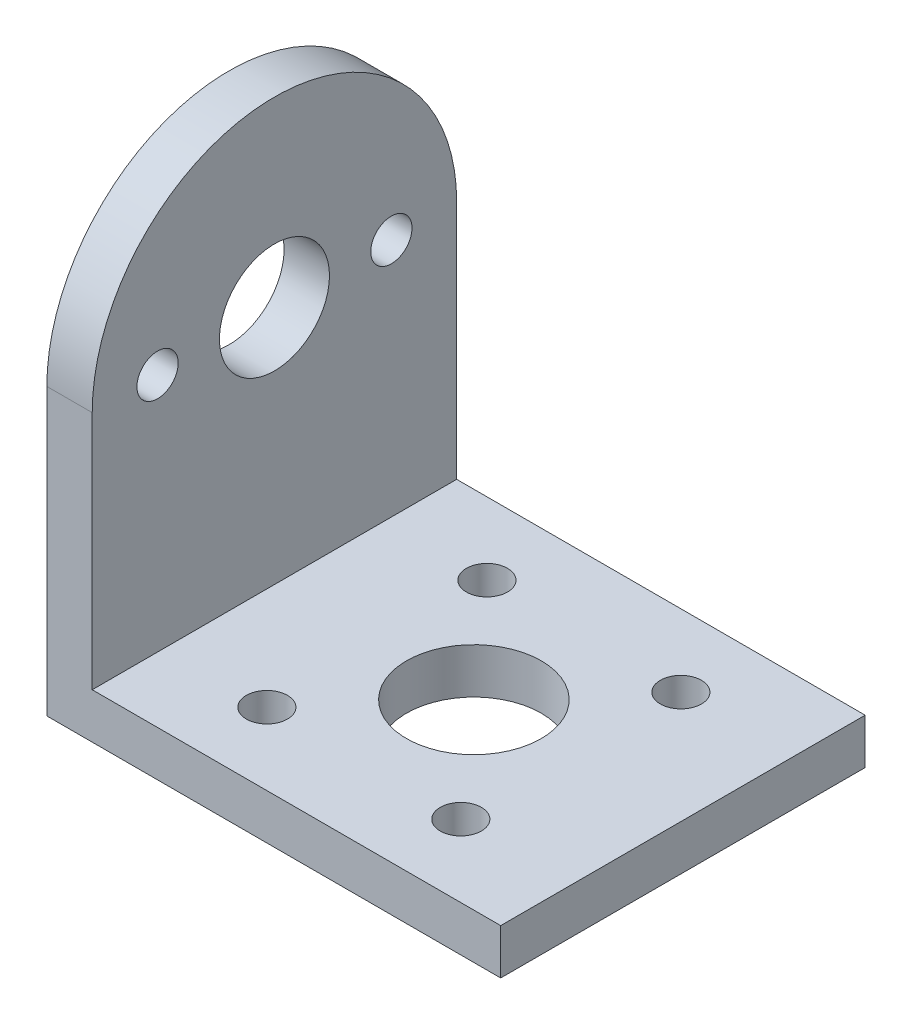
ISO-10303-21;
HEADER;
FILE_DESCRIPTION(('STEP AP214'),'2;1');
FILE_NAME('part.step','',(''),(''),'','','');
FILE_SCHEMA(('AUTOMOTIVE_DESIGN { 1 0 10303 214 1 1 1 1 }'));
ENDSEC;
DATA;
#1=APPLICATION_CONTEXT('core data for automotive mechanical design processes');
#2=APPLICATION_PROTOCOL_DEFINITION('international standard','automotive_design',2000,#1);
#3=PRODUCT_CONTEXT('',#1,'mechanical');
#4=PRODUCT('Part','Part','',(#3));
#5=PRODUCT_RELATED_PRODUCT_CATEGORY('part','',(#4));
#6=PRODUCT_DEFINITION_FORMATION('','',#4);
#7=PRODUCT_DEFINITION_CONTEXT('part definition',#1,'design');
#8=PRODUCT_DEFINITION('design','',#6,#7);
#9=PRODUCT_DEFINITION_SHAPE('','',#8);
#10=(LENGTH_UNIT() NAMED_UNIT(*) SI_UNIT(.MILLI.,.METRE.));
#11=(NAMED_UNIT(*) PLANE_ANGLE_UNIT() SI_UNIT($,.RADIAN.));
#12=(NAMED_UNIT(*) SI_UNIT($,.STERADIAN.) SOLID_ANGLE_UNIT());
#13=UNCERTAINTY_MEASURE_WITH_UNIT(LENGTH_MEASURE(1.E-05),#10,'distance_accuracy_value','');
#14=(GEOMETRIC_REPRESENTATION_CONTEXT(3) GLOBAL_UNCERTAINTY_ASSIGNED_CONTEXT((#13)) GLOBAL_UNIT_ASSIGNED_CONTEXT((#10,
#11,#12)) REPRESENTATION_CONTEXT('',''));
#15=CARTESIAN_POINT('',(0.,0.,0.));
#16=DIRECTION('',(0.,0.,1.));
#17=DIRECTION('',(1.,0.,0.));
#18=AXIS2_PLACEMENT_3D('',#15,#16,#17);
#19=CARTESIAN_POINT('',(3.3,0.,0.));
#20=DIRECTION('',(1.,0.,0.));
#21=DIRECTION('',(0.,0.,-1.));
#22=AXIS2_PLACEMENT_3D('',#19,#20,#21);
#23=PLANE('',#22);
#24=CARTESIAN_POINT('',(3.3,0.,0.));
#25=DIRECTION('',(1.,0.,0.));
#26=DIRECTION('',(0.,0.,-1.));
#27=AXIS2_PLACEMENT_3D('',#24,#25,#26);
#28=CIRCLE('',#27,4.);
#29=CARTESIAN_POINT('',(3.3,0.,-4.));
#30=VERTEX_POINT('',#29);
#31=EDGE_CURVE('E127',#30,#30,#28,.T.);
#32=ORIENTED_EDGE('',*,*,#31,.F.);
#33=EDGE_LOOP('',(#32));
#34=FACE_BOUND('',#33,.T.);
#35=CARTESIAN_POINT('',(3.3,0.,-8.5));
#36=DIRECTION('',(1.,0.,0.));
#37=DIRECTION('',(0.,0.,-1.));
#38=AXIS2_PLACEMENT_3D('',#35,#36,#37);
#39=CIRCLE('',#38,1.5);
#40=CARTESIAN_POINT('',(3.3,0.,-10.));
#41=VERTEX_POINT('',#40);
#42=EDGE_CURVE('E133',#41,#41,#39,.T.);
#43=ORIENTED_EDGE('',*,*,#42,.F.);
#44=EDGE_LOOP('',(#43));
#45=FACE_BOUND('',#44,.T.);
#46=CARTESIAN_POINT('',(3.3,0.,8.5));
#47=DIRECTION('',(1.,0.,0.));
#48=DIRECTION('',(0.,0.,1.));
#49=AXIS2_PLACEMENT_3D('',#46,#47,#48);
#50=CIRCLE('',#49,1.5);
#51=CARTESIAN_POINT('',(3.3,0.,10.));
#52=VERTEX_POINT('',#51);
#53=EDGE_CURVE('E121',#52,#52,#50,.T.);
#54=ORIENTED_EDGE('',*,*,#53,.F.);
#55=EDGE_LOOP('',(#54));
#56=FACE_BOUND('',#55,.T.);
#57=DIRECTION('',(0.,-1.,0.));
#58=VECTOR('',#57,1.);
#59=CARTESIAN_POINT('',(3.3,0.,13.25));
#60=LINE('',#59,#58);
#61=CARTESIAN_POINT('',(3.3,0.,13.25));
#62=VERTEX_POINT('',#61);
#63=CARTESIAN_POINT('',(3.3,-17.45,13.25));
#64=VERTEX_POINT('',#63);
#65=EDGE_CURVE('E51',#62,#64,#60,.T.);
#66=ORIENTED_EDGE('',*,*,#65,.T.);
#67=DIRECTION('',(0.,0.,-1.));
#68=VECTOR('',#67,1.);
#69=CARTESIAN_POINT('',(3.3,-17.45,0.));
#70=LINE('',#69,#68);
#71=CARTESIAN_POINT('',(3.3,-17.45,-13.25));
#72=VERTEX_POINT('',#71);
#73=EDGE_CURVE('E55',#64,#72,#70,.T.);
#74=ORIENTED_EDGE('',*,*,#73,.T.);
#75=DIRECTION('',(0.,1.,0.));
#76=VECTOR('',#75,1.);
#77=CARTESIAN_POINT('',(3.3,-20.75,-13.25));
#78=LINE('',#77,#76);
#79=CARTESIAN_POINT('',(3.3,0.,-13.25));
#80=VERTEX_POINT('',#79);
#81=EDGE_CURVE('E94',#72,#80,#78,.T.);
#82=ORIENTED_EDGE('',*,*,#81,.T.);
#83=CARTESIAN_POINT('',(3.3,0.,0.));
#84=DIRECTION('',(1.,0.,0.));
#85=DIRECTION('',(0.,0.,-1.));
#86=AXIS2_PLACEMENT_3D('',#83,#84,#85);
#87=CIRCLE('',#86,13.25);
#88=EDGE_CURVE('E139',#80,#62,#87,.T.);
#89=ORIENTED_EDGE('',*,*,#88,.T.);
#90=EDGE_LOOP('',(#66,#74,#82,#89));
#91=FACE_BOUND('',#90,.T.);
#92=ADVANCED_FACE('F36',(#34,#45,#56,#91),#23,.T.);
#93=CARTESIAN_POINT('',(0.,0.,0.));
#94=DIRECTION('',(1.,0.,0.));
#95=DIRECTION('',(0.,0.,-1.));
#96=AXIS2_PLACEMENT_3D('',#93,#94,#95);
#97=PLANE('',#96);
#98=DIRECTION('',(0.,0.,-1.));
#99=VECTOR('',#98,1.);
#100=CARTESIAN_POINT('',(0.,-20.75,13.25));
#101=LINE('',#100,#99);
#102=CARTESIAN_POINT('',(0.,-20.75,13.25));
#103=VERTEX_POINT('',#102);
#104=CARTESIAN_POINT('',(0.,-20.75,-13.25));
#105=VERTEX_POINT('',#104);
#106=EDGE_CURVE('E149',#103,#105,#101,.T.);
#107=ORIENTED_EDGE('',*,*,#106,.F.);
#108=DIRECTION('',(0.,-1.,0.));
#109=VECTOR('',#108,1.);
#110=CARTESIAN_POINT('',(0.,0.,13.25));
#111=LINE('',#110,#109);
#112=CARTESIAN_POINT('',(0.,0.,13.25));
#113=VERTEX_POINT('',#112);
#114=EDGE_CURVE('E147',#113,#103,#111,.T.);
#115=ORIENTED_EDGE('',*,*,#114,.F.);
#116=CARTESIAN_POINT('',(0.,0.,0.));
#117=DIRECTION('',(1.,0.,0.));
#118=DIRECTION('',(0.,0.,-1.));
#119=AXIS2_PLACEMENT_3D('',#116,#117,#118);
#120=CIRCLE('',#119,13.25);
#121=CARTESIAN_POINT('',(0.,0.,-13.25));
#122=VERTEX_POINT('',#121);
#123=EDGE_CURVE('E136',#122,#113,#120,.T.);
#124=ORIENTED_EDGE('',*,*,#123,.F.);
#125=DIRECTION('',(0.,1.,0.));
#126=VECTOR('',#125,1.);
#127=CARTESIAN_POINT('',(0.,-20.75,-13.25));
#128=LINE('',#127,#126);
#129=EDGE_CURVE('E141',#105,#122,#128,.T.);
#130=ORIENTED_EDGE('',*,*,#129,.F.);
#131=EDGE_LOOP('',(#107,#115,#124,#130));
#132=FACE_BOUND('',#131,.T.);
#133=CARTESIAN_POINT('',(0.,0.,8.5));
#134=DIRECTION('',(1.,0.,0.));
#135=DIRECTION('',(0.,0.,1.));
#136=AXIS2_PLACEMENT_3D('',#133,#134,#135);
#137=CIRCLE('',#136,1.5);
#138=CARTESIAN_POINT('',(0.,0.,10.));
#139=VERTEX_POINT('',#138);
#140=EDGE_CURVE('E120',#139,#139,#137,.T.);
#141=ORIENTED_EDGE('',*,*,#140,.T.);
#142=EDGE_LOOP('',(#141));
#143=FACE_BOUND('',#142,.T.);
#144=CARTESIAN_POINT('',(0.,0.,0.));
#145=DIRECTION('',(1.,0.,0.));
#146=DIRECTION('',(0.,0.,-1.));
#147=AXIS2_PLACEMENT_3D('',#144,#145,#146);
#148=CIRCLE('',#147,4.);
#149=CARTESIAN_POINT('',(0.,0.,-4.));
#150=VERTEX_POINT('',#149);
#151=EDGE_CURVE('E124',#150,#150,#148,.T.);
#152=ORIENTED_EDGE('',*,*,#151,.T.);
#153=EDGE_LOOP('',(#152));
#154=FACE_BOUND('',#153,.T.);
#155=CARTESIAN_POINT('',(0.,0.,-8.5));
#156=DIRECTION('',(1.,0.,0.));
#157=DIRECTION('',(0.,0.,-1.));
#158=AXIS2_PLACEMENT_3D('',#155,#156,#157);
#159=CIRCLE('',#158,1.5);
#160=CARTESIAN_POINT('',(0.,0.,-10.));
#161=VERTEX_POINT('',#160);
#162=EDGE_CURVE('E130',#161,#161,#159,.T.);
#163=ORIENTED_EDGE('',*,*,#162,.T.);
#164=EDGE_LOOP('',(#163));
#165=FACE_BOUND('',#164,.T.);
#166=ADVANCED_FACE('F163',(#132,#143,#154,#165),#97,.F.);
#167=CARTESIAN_POINT('',(3.3,0.,0.));
#168=DIRECTION('',(-1.,0.,0.));
#169=DIRECTION('',(0.,0.,1.));
#170=AXIS2_PLACEMENT_3D('',#167,#168,#169);
#171=CYLINDRICAL_SURFACE('',#170,13.25);
#172=ORIENTED_EDGE('',*,*,#123,.T.);
#173=DIRECTION('',(-1.,0.,0.));
#174=VECTOR('',#173,1.);
#175=CARTESIAN_POINT('',(3.3,0.,13.25));
#176=LINE('',#175,#174);
#177=EDGE_CURVE('E11',#62,#113,#176,.T.);
#178=ORIENTED_EDGE('',*,*,#177,.F.);
#179=ORIENTED_EDGE('',*,*,#88,.F.);
#180=DIRECTION('',(-1.,0.,0.));
#181=VECTOR('',#180,1.);
#182=CARTESIAN_POINT('',(3.3,0.,-13.25));
#183=LINE('',#182,#181);
#184=EDGE_CURVE('E144',#80,#122,#183,.T.);
#185=ORIENTED_EDGE('',*,*,#184,.T.);
#186=EDGE_LOOP('',(#172,#178,#179,#185));
#187=FACE_BOUND('',#186,.T.);
#188=ADVANCED_FACE('F38',(#187),#171,.T.);
#189=CARTESIAN_POINT('',(3.3,0.,13.25));
#190=DIRECTION('',(0.,0.,-1.));
#191=DIRECTION('',(0.,1.,0.));
#192=AXIS2_PLACEMENT_3D('',#189,#190,#191);
#193=PLANE('',#192);
#194=DIRECTION('',(-1.,0.,0.));
#195=VECTOR('',#194,1.);
#196=CARTESIAN_POINT('',(3.3,-20.75,13.25));
#197=LINE('',#196,#195);
#198=CARTESIAN_POINT('',(33.,-20.75,13.25));
#199=VERTEX_POINT('',#198);
#200=EDGE_CURVE('E44',#199,#103,#197,.T.);
#201=ORIENTED_EDGE('',*,*,#200,.F.);
#202=DIRECTION('',(0.,-1.,0.));
#203=VECTOR('',#202,1.);
#204=CARTESIAN_POINT('',(33.,-17.45,13.25));
#205=LINE('',#204,#203);
#206=CARTESIAN_POINT('',(33.,-17.45,13.25));
#207=VERTEX_POINT('',#206);
#208=EDGE_CURVE('E106',#207,#199,#205,.T.);
#209=ORIENTED_EDGE('',*,*,#208,.F.);
#210=DIRECTION('',(-1.,0.,0.));
#211=VECTOR('',#210,1.);
#212=CARTESIAN_POINT('',(33.,-17.45,13.25));
#213=LINE('',#212,#211);
#214=EDGE_CURVE('E107',#207,#64,#213,.T.);
#215=ORIENTED_EDGE('',*,*,#214,.T.);
#216=ORIENTED_EDGE('',*,*,#65,.F.);
#217=ORIENTED_EDGE('',*,*,#177,.T.);
#218=ORIENTED_EDGE('',*,*,#114,.T.);
#219=EDGE_LOOP('',(#201,#209,#215,#216,#217,#218));
#220=FACE_BOUND('',#219,.T.);
#221=ADVANCED_FACE('F185',(#220),#193,.F.);
#222=CARTESIAN_POINT('',(3.3,-20.75,13.25));
#223=DIRECTION('',(0.,1.,0.));
#224=DIRECTION('',(0.,0.,1.));
#225=AXIS2_PLACEMENT_3D('',#222,#223,#224);
#226=PLANE('',#225);
#227=ORIENTED_EDGE('',*,*,#106,.T.);
#228=DIRECTION('',(-1.,0.,0.));
#229=VECTOR('',#228,1.);
#230=CARTESIAN_POINT('',(3.3,-20.75,-13.25));
#231=LINE('',#230,#229);
#232=CARTESIAN_POINT('',(33.,-20.75,-13.25));
#233=VERTEX_POINT('',#232);
#234=EDGE_CURVE('E154',#233,#105,#231,.T.);
#235=ORIENTED_EDGE('',*,*,#234,.F.);
#236=DIRECTION('',(0.,0.,1.));
#237=VECTOR('',#236,1.);
#238=CARTESIAN_POINT('',(33.,-20.75,-13.25));
#239=LINE('',#238,#237);
#240=EDGE_CURVE('E98',#233,#199,#239,.T.);
#241=ORIENTED_EDGE('',*,*,#240,.T.);
#242=ORIENTED_EDGE('',*,*,#200,.T.);
#243=EDGE_LOOP('',(#227,#235,#241,#242));
#244=FACE_BOUND('',#243,.T.);
#245=CARTESIAN_POINT('',(10.75,-20.75,-8.));
#246=DIRECTION('',(0.,-1.,0.));
#247=DIRECTION('',(0.,0.,1.));
#248=AXIS2_PLACEMENT_3D('',#245,#246,#247);
#249=CIRCLE('',#248,1.49542790932673);
#250=CARTESIAN_POINT('',(10.75,-20.75,-6.50457209067327));
#251=VERTEX_POINT('',#250);
#252=EDGE_CURVE('E343',#251,#251,#249,.T.);
#253=ORIENTED_EDGE('',*,*,#252,.F.);
#254=EDGE_LOOP('',(#253));
#255=FACE_BOUND('',#254,.T.);
#256=CARTESIAN_POINT('',(10.75,-20.75,8.));
#257=DIRECTION('',(0.,-1.,0.));
#258=DIRECTION('',(0.,0.,-1.));
#259=AXIS2_PLACEMENT_3D('',#256,#257,#258);
#260=CIRCLE('',#259,1.49542790932673);
#261=CARTESIAN_POINT('',(10.75,-20.75,6.50457209067327));
#262=VERTEX_POINT('',#261);
#263=EDGE_CURVE('E345',#262,#262,#260,.T.);
#264=ORIENTED_EDGE('',*,*,#263,.F.);
#265=EDGE_LOOP('',(#264));
#266=FACE_BOUND('',#265,.T.);
#267=CARTESIAN_POINT('',(24.85,-20.75,8.));
#268=DIRECTION('',(0.,-1.,0.));
#269=DIRECTION('',(0.,0.,1.));
#270=AXIS2_PLACEMENT_3D('',#267,#268,#269);
#271=CIRCLE('',#270,1.49542790932673);
#272=CARTESIAN_POINT('',(24.85,-20.75,9.49542790932673));
#273=VERTEX_POINT('',#272);
#274=EDGE_CURVE('E351',#273,#273,#271,.T.);
#275=ORIENTED_EDGE('',*,*,#274,.F.);
#276=EDGE_LOOP('',(#275));
#277=FACE_BOUND('',#276,.T.);
#278=CARTESIAN_POINT('',(24.85,-20.75,-8.));
#279=DIRECTION('',(0.,-1.,0.));
#280=DIRECTION('',(0.,0.,-1.));
#281=AXIS2_PLACEMENT_3D('',#278,#279,#280);
#282=CIRCLE('',#281,1.49542790932673);
#283=CARTESIAN_POINT('',(24.85,-20.75,-9.49542790932673));
#284=VERTEX_POINT('',#283);
#285=EDGE_CURVE('E357',#284,#284,#282,.T.);
#286=ORIENTED_EDGE('',*,*,#285,.F.);
#287=EDGE_LOOP('',(#286));
#288=FACE_BOUND('',#287,.T.);
#289=CARTESIAN_POINT('',(17.8,-20.75,0.));
#290=DIRECTION('',(0.,-1.,0.));
#291=DIRECTION('',(0.,0.,-1.));
#292=AXIS2_PLACEMENT_3D('',#289,#290,#291);
#293=CIRCLE('',#292,4.9);
#294=CARTESIAN_POINT('',(17.8,-20.75,-4.9));
#295=VERTEX_POINT('',#294);
#296=EDGE_CURVE('E363',#295,#295,#293,.T.);
#297=ORIENTED_EDGE('',*,*,#296,.F.);
#298=EDGE_LOOP('',(#297));
#299=FACE_BOUND('',#298,.T.);
#300=ADVANCED_FACE('F158',(#244,#255,#266,#277,#288,#299),#226,.F.);
#301=CARTESIAN_POINT('',(3.3,-20.75,-13.25));
#302=DIRECTION('',(0.,0.,1.));
#303=DIRECTION('',(0.,-1.,0.));
#304=AXIS2_PLACEMENT_3D('',#301,#302,#303);
#305=PLANE('',#304);
#306=ORIENTED_EDGE('',*,*,#129,.T.);
#307=ORIENTED_EDGE('',*,*,#184,.F.);
#308=ORIENTED_EDGE('',*,*,#81,.F.);
#309=DIRECTION('',(1.,0.,0.));
#310=VECTOR('',#309,1.);
#311=CARTESIAN_POINT('',(0.,-17.45,-13.25));
#312=LINE('',#311,#310);
#313=CARTESIAN_POINT('',(33.,-17.45,-13.25));
#314=VERTEX_POINT('',#313);
#315=EDGE_CURVE('E87',#72,#314,#312,.T.);
#316=ORIENTED_EDGE('',*,*,#315,.T.);
#317=DIRECTION('',(0.,-1.,0.));
#318=VECTOR('',#317,1.);
#319=CARTESIAN_POINT('',(33.,-17.45,-13.25));
#320=LINE('',#319,#318);
#321=EDGE_CURVE('E91',#314,#233,#320,.T.);
#322=ORIENTED_EDGE('',*,*,#321,.T.);
#323=ORIENTED_EDGE('',*,*,#234,.T.);
#324=EDGE_LOOP('',(#306,#307,#308,#316,#322,#323));
#325=FACE_BOUND('',#324,.T.);
#326=ADVANCED_FACE('F89',(#325),#305,.F.);
#327=CARTESIAN_POINT('',(3.3,0.,-8.5));
#328=DIRECTION('',(-1.,0.,0.));
#329=DIRECTION('',(0.,0.,1.));
#330=AXIS2_PLACEMENT_3D('',#327,#328,#329);
#331=CYLINDRICAL_SURFACE('',#330,1.5);
#332=ORIENTED_EDGE('',*,*,#42,.T.);
#333=EDGE_LOOP('',(#332));
#334=FACE_BOUND('',#333,.T.);
#335=ORIENTED_EDGE('',*,*,#162,.F.);
#336=EDGE_LOOP('',(#335));
#337=FACE_BOUND('',#336,.T.);
#338=ADVANCED_FACE('F179',(#334,#337),#331,.F.);
#339=CARTESIAN_POINT('',(3.3,0.,0.));
#340=DIRECTION('',(-1.,0.,0.));
#341=DIRECTION('',(0.,0.,1.));
#342=AXIS2_PLACEMENT_3D('',#339,#340,#341);
#343=CYLINDRICAL_SURFACE('',#342,4.);
#344=ORIENTED_EDGE('',*,*,#31,.T.);
#345=EDGE_LOOP('',(#344));
#346=FACE_BOUND('',#345,.T.);
#347=ORIENTED_EDGE('',*,*,#151,.F.);
#348=EDGE_LOOP('',(#347));
#349=FACE_BOUND('',#348,.T.);
#350=ADVANCED_FACE('F295',(#346,#349),#343,.F.);
#351=CARTESIAN_POINT('',(3.3,0.,8.5));
#352=DIRECTION('',(-1.,0.,0.));
#353=DIRECTION('',(0.,0.,1.));
#354=AXIS2_PLACEMENT_3D('',#351,#352,#353);
#355=CYLINDRICAL_SURFACE('',#354,1.5);
#356=ORIENTED_EDGE('',*,*,#53,.T.);
#357=EDGE_LOOP('',(#356));
#358=FACE_BOUND('',#357,.T.);
#359=ORIENTED_EDGE('',*,*,#140,.F.);
#360=EDGE_LOOP('',(#359));
#361=FACE_BOUND('',#360,.T.);
#362=ADVANCED_FACE('F229',(#358,#361),#355,.F.);
#363=CARTESIAN_POINT('',(33.,-17.45,-13.25));
#364=DIRECTION('',(1.,0.,0.));
#365=DIRECTION('',(0.,0.,-1.));
#366=AXIS2_PLACEMENT_3D('',#363,#364,#365);
#367=PLANE('',#366);
#368=ORIENTED_EDGE('',*,*,#240,.F.);
#369=ORIENTED_EDGE('',*,*,#321,.F.);
#370=DIRECTION('',(0.,0.,1.));
#371=VECTOR('',#370,1.);
#372=CARTESIAN_POINT('',(33.,-17.45,-13.25));
#373=LINE('',#372,#371);
#374=EDGE_CURVE('E97',#314,#207,#373,.T.);
#375=ORIENTED_EDGE('',*,*,#374,.T.);
#376=ORIENTED_EDGE('',*,*,#208,.T.);
#377=EDGE_LOOP('',(#368,#369,#375,#376));
#378=FACE_BOUND('',#377,.T.);
#379=ADVANCED_FACE('F102',(#378),#367,.T.);
#380=CARTESIAN_POINT('',(0.,-17.45,0.));
#381=DIRECTION('',(0.,-1.,0.));
#382=DIRECTION('',(0.,0.,-1.));
#383=AXIS2_PLACEMENT_3D('',#380,#381,#382);
#384=PLANE('',#383);
#385=ORIENTED_EDGE('',*,*,#73,.F.);
#386=ORIENTED_EDGE('',*,*,#214,.F.);
#387=ORIENTED_EDGE('',*,*,#374,.F.);
#388=ORIENTED_EDGE('',*,*,#315,.F.);
#389=EDGE_LOOP('',(#385,#386,#387,#388));
#390=FACE_BOUND('',#389,.T.);
#391=CARTESIAN_POINT('',(10.75,-17.45,-8.));
#392=DIRECTION('',(0.,-1.,0.));
#393=DIRECTION('',(0.,0.,1.));
#394=AXIS2_PLACEMENT_3D('',#391,#392,#393);
#395=CIRCLE('',#394,1.49542790932673);
#396=CARTESIAN_POINT('',(10.75,-17.45,-6.50457209067327));
#397=VERTEX_POINT('',#396);
#398=EDGE_CURVE('E340',#397,#397,#395,.T.);
#399=ORIENTED_EDGE('',*,*,#398,.T.);
#400=EDGE_LOOP('',(#399));
#401=FACE_BOUND('',#400,.T.);
#402=CARTESIAN_POINT('',(10.75,-17.45,8.));
#403=DIRECTION('',(0.,-1.,0.));
#404=DIRECTION('',(0.,0.,-1.));
#405=AXIS2_PLACEMENT_3D('',#402,#403,#404);
#406=CIRCLE('',#405,1.49542790932673);
#407=CARTESIAN_POINT('',(10.75,-17.45,6.50457209067327));
#408=VERTEX_POINT('',#407);
#409=EDGE_CURVE('E348',#408,#408,#406,.T.);
#410=ORIENTED_EDGE('',*,*,#409,.T.);
#411=EDGE_LOOP('',(#410));
#412=FACE_BOUND('',#411,.T.);
#413=CARTESIAN_POINT('',(24.85,-17.45,8.));
#414=DIRECTION('',(0.,-1.,0.));
#415=DIRECTION('',(0.,0.,1.));
#416=AXIS2_PLACEMENT_3D('',#413,#414,#415);
#417=CIRCLE('',#416,1.49542790932673);
#418=CARTESIAN_POINT('',(24.85,-17.45,9.49542790932673));
#419=VERTEX_POINT('',#418);
#420=EDGE_CURVE('E354',#419,#419,#417,.T.);
#421=ORIENTED_EDGE('',*,*,#420,.T.);
#422=EDGE_LOOP('',(#421));
#423=FACE_BOUND('',#422,.T.);
#424=CARTESIAN_POINT('',(24.85,-17.45,-8.));
#425=DIRECTION('',(0.,-1.,0.));
#426=DIRECTION('',(0.,0.,-1.));
#427=AXIS2_PLACEMENT_3D('',#424,#425,#426);
#428=CIRCLE('',#427,1.49542790932673);
#429=CARTESIAN_POINT('',(24.85,-17.45,-9.49542790932673));
#430=VERTEX_POINT('',#429);
#431=EDGE_CURVE('E360',#430,#430,#428,.T.);
#432=ORIENTED_EDGE('',*,*,#431,.T.);
#433=EDGE_LOOP('',(#432));
#434=FACE_BOUND('',#433,.T.);
#435=CARTESIAN_POINT('',(17.8,-17.45,0.));
#436=DIRECTION('',(0.,-1.,0.));
#437=DIRECTION('',(0.,0.,-1.));
#438=AXIS2_PLACEMENT_3D('',#435,#436,#437);
#439=CIRCLE('',#438,4.9);
#440=CARTESIAN_POINT('',(17.8,-17.45,-4.9));
#441=VERTEX_POINT('',#440);
#442=EDGE_CURVE('E117',#441,#441,#439,.T.);
#443=ORIENTED_EDGE('',*,*,#442,.T.);
#444=EDGE_LOOP('',(#443));
#445=FACE_BOUND('',#444,.T.);
#446=ADVANCED_FACE('F109',(#390,#401,#412,#423,#434,#445),#384,.F.);
#447=CARTESIAN_POINT('',(17.8,-17.45,0.));
#448=DIRECTION('',(0.,-1.,0.));
#449=DIRECTION('',(0.,0.,-1.));
#450=AXIS2_PLACEMENT_3D('',#447,#448,#449);
#451=CYLINDRICAL_SURFACE('',#450,4.9);
#452=ORIENTED_EDGE('',*,*,#442,.F.);
#453=EDGE_LOOP('',(#452));
#454=FACE_BOUND('',#453,.T.);
#455=ORIENTED_EDGE('',*,*,#296,.T.);
#456=EDGE_LOOP('',(#455));
#457=FACE_BOUND('',#456,.T.);
#458=ADVANCED_FACE('F239',(#454,#457),#451,.F.);
#459=CARTESIAN_POINT('',(24.85,-17.45,-8.));
#460=DIRECTION('',(0.,-1.,0.));
#461=DIRECTION('',(0.,0.,-1.));
#462=AXIS2_PLACEMENT_3D('',#459,#460,#461);
#463=CYLINDRICAL_SURFACE('',#462,1.49542790932673);
#464=ORIENTED_EDGE('',*,*,#431,.F.);
#465=EDGE_LOOP('',(#464));
#466=FACE_BOUND('',#465,.T.);
#467=ORIENTED_EDGE('',*,*,#285,.T.);
#468=EDGE_LOOP('',(#467));
#469=FACE_BOUND('',#468,.T.);
#470=ADVANCED_FACE('F248',(#466,#469),#463,.F.);
#471=CARTESIAN_POINT('',(24.85,-17.45,8.));
#472=DIRECTION('',(0.,-1.,0.));
#473=DIRECTION('',(0.,0.,-1.));
#474=AXIS2_PLACEMENT_3D('',#471,#472,#473);
#475=CYLINDRICAL_SURFACE('',#474,1.49542790932673);
#476=ORIENTED_EDGE('',*,*,#420,.F.);
#477=EDGE_LOOP('',(#476));
#478=FACE_BOUND('',#477,.T.);
#479=ORIENTED_EDGE('',*,*,#274,.T.);
#480=EDGE_LOOP('',(#479));
#481=FACE_BOUND('',#480,.T.);
#482=ADVANCED_FACE('F258',(#478,#481),#475,.F.);
#483=CARTESIAN_POINT('',(10.75,-17.45,8.));
#484=DIRECTION('',(0.,-1.,0.));
#485=DIRECTION('',(0.,0.,-1.));
#486=AXIS2_PLACEMENT_3D('',#483,#484,#485);
#487=CYLINDRICAL_SURFACE('',#486,1.49542790932673);
#488=ORIENTED_EDGE('',*,*,#409,.F.);
#489=EDGE_LOOP('',(#488));
#490=FACE_BOUND('',#489,.T.);
#491=ORIENTED_EDGE('',*,*,#263,.T.);
#492=EDGE_LOOP('',(#491));
#493=FACE_BOUND('',#492,.T.);
#494=ADVANCED_FACE('F268',(#490,#493),#487,.F.);
#495=CARTESIAN_POINT('',(10.75,-17.45,-8.));
#496=DIRECTION('',(0.,-1.,0.));
#497=DIRECTION('',(0.,0.,-1.));
#498=AXIS2_PLACEMENT_3D('',#495,#496,#497);
#499=CYLINDRICAL_SURFACE('',#498,1.49542790932673);
#500=ORIENTED_EDGE('',*,*,#398,.F.);
#501=EDGE_LOOP('',(#500));
#502=FACE_BOUND('',#501,.T.);
#503=ORIENTED_EDGE('',*,*,#252,.T.);
#504=EDGE_LOOP('',(#503));
#505=FACE_BOUND('',#504,.T.);
#506=ADVANCED_FACE('F278',(#502,#505),#499,.F.);
#507=CLOSED_SHELL('',(#92,#166,#188,#221,#300,#326,#338,#350,#362,#379,#446,#458,#470,#482,#494,#506));
#508=MANIFOLD_SOLID_BREP('B2',#507);
#509=ADVANCED_BREP_SHAPE_REPRESENTATION('',(#18,#508),#14);
#510=SHAPE_DEFINITION_REPRESENTATION(#9,#509);
ENDSEC;
END-ISO-10303-21;
